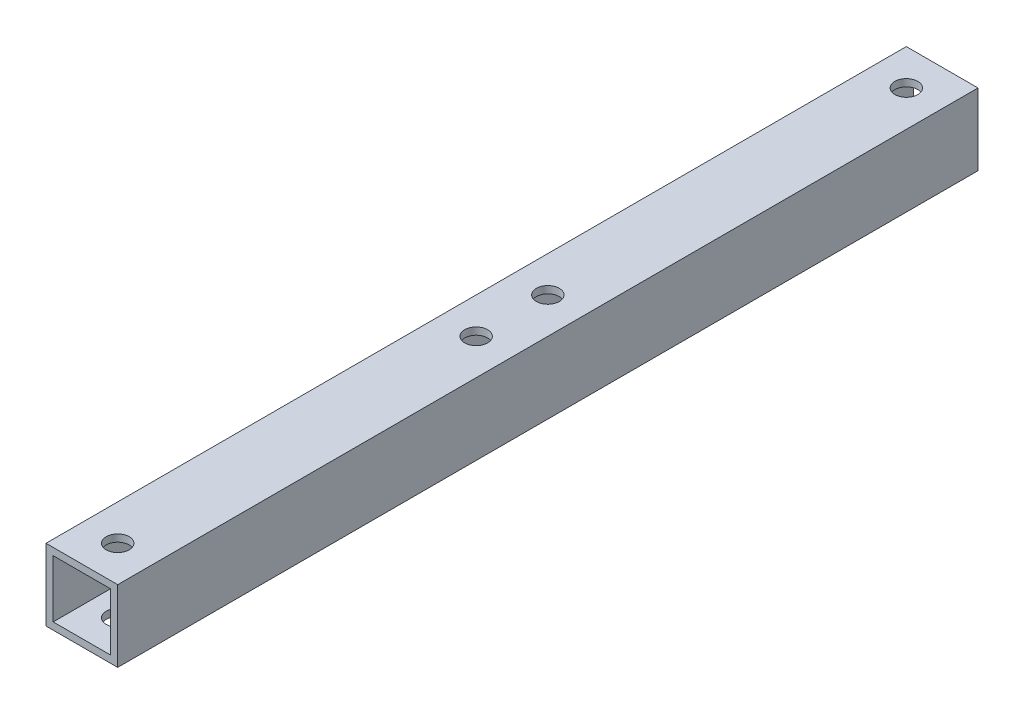
ISO-10303-21;
HEADER;
FILE_DESCRIPTION(('STEP AP214'),'2;1');
FILE_NAME('part.step','',(''),(''),'','','');
FILE_SCHEMA(('AUTOMOTIVE_DESIGN { 1 0 10303 214 1 1 1 1 }'));
ENDSEC;
DATA;
#1=APPLICATION_CONTEXT('core data for automotive mechanical design processes');
#2=APPLICATION_PROTOCOL_DEFINITION('international standard','automotive_design',2000,#1);
#3=PRODUCT_CONTEXT('',#1,'mechanical');
#4=PRODUCT('Part','Part','',(#3));
#5=PRODUCT_RELATED_PRODUCT_CATEGORY('part','',(#4));
#6=PRODUCT_DEFINITION_FORMATION('','',#4);
#7=PRODUCT_DEFINITION_CONTEXT('part definition',#1,'design');
#8=PRODUCT_DEFINITION('design','',#6,#7);
#9=PRODUCT_DEFINITION_SHAPE('','',#8);
#10=(LENGTH_UNIT() NAMED_UNIT(*) SI_UNIT(.MILLI.,.METRE.));
#11=(NAMED_UNIT(*) PLANE_ANGLE_UNIT() SI_UNIT($,.RADIAN.));
#12=(NAMED_UNIT(*) SI_UNIT($,.STERADIAN.) SOLID_ANGLE_UNIT());
#13=UNCERTAINTY_MEASURE_WITH_UNIT(LENGTH_MEASURE(1.E-05),#10,'distance_accuracy_value','');
#14=(GEOMETRIC_REPRESENTATION_CONTEXT(3) GLOBAL_UNCERTAINTY_ASSIGNED_CONTEXT((#13)) GLOBAL_UNIT_ASSIGNED_CONTEXT((#10,
#11,#12)) REPRESENTATION_CONTEXT('',''));
#15=CARTESIAN_POINT('',(0.,0.,0.));
#16=DIRECTION('',(0.,0.,1.));
#17=DIRECTION('',(1.,0.,0.));
#18=AXIS2_PLACEMENT_3D('',#15,#16,#17);
#19=CARTESIAN_POINT('',(0.,0.,120.));
#20=DIRECTION('',(0.,0.,1.));
#21=DIRECTION('',(1.,0.,0.));
#22=AXIS2_PLACEMENT_3D('',#19,#20,#21);
#23=PLANE('',#22);
#24=DIRECTION('',(0.,1.,0.));
#25=VECTOR('',#24,1.);
#26=CARTESIAN_POINT('',(5.,-5.,120.));
#27=LINE('',#26,#25);
#28=CARTESIAN_POINT('',(5.,-5.,120.));
#29=VERTEX_POINT('',#28);
#30=CARTESIAN_POINT('',(5.,5.,120.));
#31=VERTEX_POINT('',#30);
#32=EDGE_CURVE('E162',#29,#31,#27,.T.);
#33=ORIENTED_EDGE('',*,*,#32,.T.);
#34=DIRECTION('',(-1.,0.,0.));
#35=VECTOR('',#34,1.);
#36=CARTESIAN_POINT('',(-5.,5.,120.));
#37=LINE('',#36,#35);
#38=CARTESIAN_POINT('',(-5.,5.,120.));
#39=VERTEX_POINT('',#38);
#40=EDGE_CURVE('E165',#31,#39,#37,.T.);
#41=ORIENTED_EDGE('',*,*,#40,.T.);
#42=DIRECTION('',(0.,-1.,0.));
#43=VECTOR('',#42,1.);
#44=CARTESIAN_POINT('',(-5.,-5.,120.));
#45=LINE('',#44,#43);
#46=CARTESIAN_POINT('',(-5.,-5.,120.));
#47=VERTEX_POINT('',#46);
#48=EDGE_CURVE('E168',#39,#47,#45,.T.);
#49=ORIENTED_EDGE('',*,*,#48,.T.);
#50=DIRECTION('',(1.,0.,0.));
#51=VECTOR('',#50,1.);
#52=CARTESIAN_POINT('',(-5.,-5.,120.));
#53=LINE('',#52,#51);
#54=EDGE_CURVE('E170',#47,#29,#53,.T.);
#55=ORIENTED_EDGE('',*,*,#54,.T.);
#56=EDGE_LOOP('',(#33,#41,#49,#55));
#57=FACE_BOUND('',#56,.T.);
#58=DIRECTION('',(-1.,0.,0.));
#59=VECTOR('',#58,1.);
#60=CARTESIAN_POINT('',(0.,4.,120.));
#61=LINE('',#60,#59);
#62=CARTESIAN_POINT('',(4.,4.,120.));
#63=VERTEX_POINT('',#62);
#64=CARTESIAN_POINT('',(-4.,4.,120.));
#65=VERTEX_POINT('',#64);
#66=EDGE_CURVE('E132',#63,#65,#61,.T.);
#67=ORIENTED_EDGE('',*,*,#66,.F.);
#68=DIRECTION('',(0.,1.,0.));
#69=VECTOR('',#68,1.);
#70=CARTESIAN_POINT('',(4.,0.,120.));
#71=LINE('',#70,#69);
#72=CARTESIAN_POINT('',(4.,-4.,120.));
#73=VERTEX_POINT('',#72);
#74=EDGE_CURVE('E124',#73,#63,#71,.T.);
#75=ORIENTED_EDGE('',*,*,#74,.F.);
#76=DIRECTION('',(1.,0.,0.));
#77=VECTOR('',#76,1.);
#78=CARTESIAN_POINT('',(0.,-4.,120.));
#79=LINE('',#78,#77);
#80=CARTESIAN_POINT('',(-4.,-4.,120.));
#81=VERTEX_POINT('',#80);
#82=EDGE_CURVE('E146',#81,#73,#79,.T.);
#83=ORIENTED_EDGE('',*,*,#82,.F.);
#84=DIRECTION('',(0.,-1.,0.));
#85=VECTOR('',#84,1.);
#86=CARTESIAN_POINT('',(-4.,0.,120.));
#87=LINE('',#86,#85);
#88=EDGE_CURVE('E144',#65,#81,#87,.T.);
#89=ORIENTED_EDGE('',*,*,#88,.F.);
#90=EDGE_LOOP('',(#67,#75,#83,#89));
#91=FACE_BOUND('',#90,.T.);
#92=ADVANCED_FACE('F57',(#57,#91),#23,.T.);
#93=CARTESIAN_POINT('',(0.,0.,0.));
#94=DIRECTION('',(0.,0.,1.));
#95=DIRECTION('',(1.,0.,0.));
#96=AXIS2_PLACEMENT_3D('',#93,#94,#95);
#97=PLANE('',#96);
#98=DIRECTION('',(0.,1.,0.));
#99=VECTOR('',#98,1.);
#100=CARTESIAN_POINT('',(5.,-5.,0.));
#101=LINE('',#100,#99);
#102=CARTESIAN_POINT('',(5.,-5.,0.));
#103=VERTEX_POINT('',#102);
#104=CARTESIAN_POINT('',(5.,5.,0.));
#105=VERTEX_POINT('',#104);
#106=EDGE_CURVE('E140',#103,#105,#101,.T.);
#107=ORIENTED_EDGE('',*,*,#106,.F.);
#108=DIRECTION('',(1.,0.,0.));
#109=VECTOR('',#108,1.);
#110=CARTESIAN_POINT('',(-5.,-5.,0.));
#111=LINE('',#110,#109);
#112=CARTESIAN_POINT('',(-5.,-5.,0.));
#113=VERTEX_POINT('',#112);
#114=EDGE_CURVE('E166',#113,#103,#111,.T.);
#115=ORIENTED_EDGE('',*,*,#114,.F.);
#116=DIRECTION('',(0.,-1.,0.));
#117=VECTOR('',#116,1.);
#118=CARTESIAN_POINT('',(-5.,-5.,0.));
#119=LINE('',#118,#117);
#120=CARTESIAN_POINT('',(-5.,5.,0.));
#121=VERTEX_POINT('',#120);
#122=EDGE_CURVE('E177',#121,#113,#119,.T.);
#123=ORIENTED_EDGE('',*,*,#122,.F.);
#124=DIRECTION('',(-1.,0.,0.));
#125=VECTOR('',#124,1.);
#126=CARTESIAN_POINT('',(-5.,5.,0.));
#127=LINE('',#126,#125);
#128=EDGE_CURVE('E175',#105,#121,#127,.T.);
#129=ORIENTED_EDGE('',*,*,#128,.F.);
#130=EDGE_LOOP('',(#107,#115,#123,#129));
#131=FACE_BOUND('',#130,.T.);
#132=DIRECTION('',(0.,1.,0.));
#133=VECTOR('',#132,1.);
#134=CARTESIAN_POINT('',(4.,0.,0.));
#135=LINE('',#134,#133);
#136=CARTESIAN_POINT('',(4.,-4.,0.));
#137=VERTEX_POINT('',#136);
#138=CARTESIAN_POINT('',(4.,4.,0.));
#139=VERTEX_POINT('',#138);
#140=EDGE_CURVE('E82',#137,#139,#135,.T.);
#141=ORIENTED_EDGE('',*,*,#140,.T.);
#142=DIRECTION('',(-1.,0.,0.));
#143=VECTOR('',#142,1.);
#144=CARTESIAN_POINT('',(0.,4.,0.));
#145=LINE('',#144,#143);
#146=CARTESIAN_POINT('',(-4.,4.,0.));
#147=VERTEX_POINT('',#146);
#148=EDGE_CURVE('E139',#139,#147,#145,.T.);
#149=ORIENTED_EDGE('',*,*,#148,.T.);
#150=DIRECTION('',(0.,-1.,0.));
#151=VECTOR('',#150,1.);
#152=CARTESIAN_POINT('',(-4.,0.,0.));
#153=LINE('',#152,#151);
#154=CARTESIAN_POINT('',(-4.,-4.,0.));
#155=VERTEX_POINT('',#154);
#156=EDGE_CURVE('E154',#147,#155,#153,.T.);
#157=ORIENTED_EDGE('',*,*,#156,.T.);
#158=DIRECTION('',(1.,0.,0.));
#159=VECTOR('',#158,1.);
#160=CARTESIAN_POINT('',(0.,-4.,0.));
#161=LINE('',#160,#159);
#162=EDGE_CURVE('E133',#155,#137,#161,.T.);
#163=ORIENTED_EDGE('',*,*,#162,.T.);
#164=EDGE_LOOP('',(#141,#149,#157,#163));
#165=FACE_BOUND('',#164,.T.);
#166=ADVANCED_FACE('F229',(#131,#165),#97,.F.);
#167=CARTESIAN_POINT('',(5.,-5.,120.));
#168=DIRECTION('',(-1.,0.,0.));
#169=DIRECTION('',(0.,0.,1.));
#170=AXIS2_PLACEMENT_3D('',#167,#168,#169);
#171=PLANE('',#170);
#172=ORIENTED_EDGE('',*,*,#106,.T.);
#173=DIRECTION('',(0.,0.,-1.));
#174=VECTOR('',#173,1.);
#175=CARTESIAN_POINT('',(5.,5.,120.));
#176=LINE('',#175,#174);
#177=EDGE_CURVE('E12',#31,#105,#176,.T.);
#178=ORIENTED_EDGE('',*,*,#177,.F.);
#179=ORIENTED_EDGE('',*,*,#32,.F.);
#180=DIRECTION('',(0.,0.,-1.));
#181=VECTOR('',#180,1.);
#182=CARTESIAN_POINT('',(5.,-5.,120.));
#183=LINE('',#182,#181);
#184=EDGE_CURVE('E172',#29,#103,#183,.T.);
#185=ORIENTED_EDGE('',*,*,#184,.T.);
#186=EDGE_LOOP('',(#172,#178,#179,#185));
#187=FACE_BOUND('',#186,.T.);
#188=ADVANCED_FACE('F59',(#187),#171,.F.);
#189=CARTESIAN_POINT('',(-5.,5.,120.));
#190=DIRECTION('',(0.,-1.,0.));
#191=DIRECTION('',(0.,0.,-1.));
#192=AXIS2_PLACEMENT_3D('',#189,#190,#191);
#193=PLANE('',#192);
#194=CARTESIAN_POINT('',(0.,5.,5.));
#195=DIRECTION('',(0.,1.,0.));
#196=DIRECTION('',(0.,0.,1.));
#197=AXIS2_PLACEMENT_3D('',#194,#195,#196);
#198=CIRCLE('',#197,1.6);
#199=CARTESIAN_POINT('',(0.,5.,6.6));
#200=VERTEX_POINT('',#199);
#201=EDGE_CURVE('E265',#200,#200,#198,.T.);
#202=ORIENTED_EDGE('',*,*,#201,.F.);
#203=EDGE_LOOP('',(#202));
#204=FACE_BOUND('',#203,.T.);
#205=CARTESIAN_POINT('',(0.,5.,65.));
#206=DIRECTION('',(0.,1.,0.));
#207=DIRECTION('',(0.,0.,-1.));
#208=AXIS2_PLACEMENT_3D('',#205,#206,#207);
#209=CIRCLE('',#208,1.59999999999999);
#210=CARTESIAN_POINT('',(0.,5.,63.4));
#211=VERTEX_POINT('',#210);
#212=EDGE_CURVE('E269',#211,#211,#209,.T.);
#213=ORIENTED_EDGE('',*,*,#212,.F.);
#214=EDGE_LOOP('',(#213));
#215=FACE_BOUND('',#214,.T.);
#216=CARTESIAN_POINT('',(0.,5.,115.));
#217=DIRECTION('',(0.,1.,0.));
#218=DIRECTION('',(0.,0.,-1.));
#219=AXIS2_PLACEMENT_3D('',#216,#217,#218);
#220=CIRCLE('',#219,1.6);
#221=CARTESIAN_POINT('',(0.,5.,113.4));
#222=VERTEX_POINT('',#221);
#223=EDGE_CURVE('E273',#222,#222,#220,.T.);
#224=ORIENTED_EDGE('',*,*,#223,.F.);
#225=EDGE_LOOP('',(#224));
#226=FACE_BOUND('',#225,.T.);
#227=CARTESIAN_POINT('',(0.,5.,55.));
#228=DIRECTION('',(0.,1.,0.));
#229=DIRECTION('',(0.,0.,1.));
#230=AXIS2_PLACEMENT_3D('',#227,#228,#229);
#231=CIRCLE('',#230,1.6);
#232=CARTESIAN_POINT('',(0.,5.,56.6));
#233=VERTEX_POINT('',#232);
#234=EDGE_CURVE('E277',#233,#233,#231,.T.);
#235=ORIENTED_EDGE('',*,*,#234,.F.);
#236=EDGE_LOOP('',(#235));
#237=FACE_BOUND('',#236,.T.);
#238=ORIENTED_EDGE('',*,*,#128,.T.);
#239=DIRECTION('',(0.,0.,-1.));
#240=VECTOR('',#239,1.);
#241=CARTESIAN_POINT('',(-5.,5.,120.));
#242=LINE('',#241,#240);
#243=EDGE_CURVE('E66',#39,#121,#242,.T.);
#244=ORIENTED_EDGE('',*,*,#243,.F.);
#245=ORIENTED_EDGE('',*,*,#40,.F.);
#246=ORIENTED_EDGE('',*,*,#177,.T.);
#247=EDGE_LOOP('',(#238,#244,#245,#246));
#248=FACE_BOUND('',#247,.T.);
#249=ADVANCED_FACE('F254',(#204,#215,#226,#237,#248),#193,.F.);
#250=CARTESIAN_POINT('',(-5.,-5.,120.));
#251=DIRECTION('',(1.,0.,0.));
#252=DIRECTION('',(0.,0.,-1.));
#253=AXIS2_PLACEMENT_3D('',#250,#251,#252);
#254=PLANE('',#253);
#255=ORIENTED_EDGE('',*,*,#122,.T.);
#256=DIRECTION('',(0.,0.,-1.));
#257=VECTOR('',#256,1.);
#258=CARTESIAN_POINT('',(-5.,-5.,120.));
#259=LINE('',#258,#257);
#260=EDGE_CURVE('E182',#47,#113,#259,.T.);
#261=ORIENTED_EDGE('',*,*,#260,.F.);
#262=ORIENTED_EDGE('',*,*,#48,.F.);
#263=ORIENTED_EDGE('',*,*,#243,.T.);
#264=EDGE_LOOP('',(#255,#261,#262,#263));
#265=FACE_BOUND('',#264,.T.);
#266=ADVANCED_FACE('F251',(#265),#254,.F.);
#267=CARTESIAN_POINT('',(-5.,-5.,120.));
#268=DIRECTION('',(0.,1.,0.));
#269=DIRECTION('',(0.,0.,1.));
#270=AXIS2_PLACEMENT_3D('',#267,#268,#269);
#271=PLANE('',#270);
#272=CARTESIAN_POINT('',(0.,-5.,5.));
#273=DIRECTION('',(0.,1.,0.));
#274=DIRECTION('',(0.,0.,1.));
#275=AXIS2_PLACEMENT_3D('',#272,#273,#274);
#276=CIRCLE('',#275,1.6);
#277=CARTESIAN_POINT('',(0.,-5.,6.6));
#278=VERTEX_POINT('',#277);
#279=EDGE_CURVE('E191',#278,#278,#276,.T.);
#280=ORIENTED_EDGE('',*,*,#279,.T.);
#281=EDGE_LOOP('',(#280));
#282=FACE_BOUND('',#281,.T.);
#283=CARTESIAN_POINT('',(0.,-5.,65.));
#284=DIRECTION('',(0.,1.,0.));
#285=DIRECTION('',(0.,0.,-1.));
#286=AXIS2_PLACEMENT_3D('',#283,#284,#285);
#287=CIRCLE('',#286,1.59999999999999);
#288=CARTESIAN_POINT('',(0.,-5.,63.4));
#289=VERTEX_POINT('',#288);
#290=EDGE_CURVE('E298',#289,#289,#287,.T.);
#291=ORIENTED_EDGE('',*,*,#290,.T.);
#292=EDGE_LOOP('',(#291));
#293=FACE_BOUND('',#292,.T.);
#294=CARTESIAN_POINT('',(0.,-5.,115.));
#295=DIRECTION('',(0.,1.,0.));
#296=DIRECTION('',(0.,0.,-1.));
#297=AXIS2_PLACEMENT_3D('',#294,#295,#296);
#298=CIRCLE('',#297,1.6);
#299=CARTESIAN_POINT('',(0.,-5.,113.4));
#300=VERTEX_POINT('',#299);
#301=EDGE_CURVE('E291',#300,#300,#298,.T.);
#302=ORIENTED_EDGE('',*,*,#301,.T.);
#303=EDGE_LOOP('',(#302));
#304=FACE_BOUND('',#303,.T.);
#305=CARTESIAN_POINT('',(0.,-5.,55.));
#306=DIRECTION('',(0.,1.,0.));
#307=DIRECTION('',(0.,0.,1.));
#308=AXIS2_PLACEMENT_3D('',#305,#306,#307);
#309=CIRCLE('',#308,1.6);
#310=CARTESIAN_POINT('',(0.,-5.,56.6));
#311=VERTEX_POINT('',#310);
#312=EDGE_CURVE('E290',#311,#311,#309,.T.);
#313=ORIENTED_EDGE('',*,*,#312,.T.);
#314=EDGE_LOOP('',(#313));
#315=FACE_BOUND('',#314,.T.);
#316=ORIENTED_EDGE('',*,*,#114,.T.);
#317=ORIENTED_EDGE('',*,*,#184,.F.);
#318=ORIENTED_EDGE('',*,*,#54,.F.);
#319=ORIENTED_EDGE('',*,*,#260,.T.);
#320=EDGE_LOOP('',(#316,#317,#318,#319));
#321=FACE_BOUND('',#320,.T.);
#322=ADVANCED_FACE('F248',(#282,#293,#304,#315,#321),#271,.F.);
#323=CARTESIAN_POINT('',(4.,0.,120.));
#324=DIRECTION('',(-1.,0.,0.));
#325=DIRECTION('',(0.,0.,1.));
#326=AXIS2_PLACEMENT_3D('',#323,#324,#325);
#327=PLANE('',#326);
#328=ORIENTED_EDGE('',*,*,#140,.F.);
#329=DIRECTION('',(0.,0.,-1.));
#330=VECTOR('',#329,1.);
#331=CARTESIAN_POINT('',(4.,-4.,120.));
#332=LINE('',#331,#330);
#333=EDGE_CURVE('E128',#73,#137,#332,.T.);
#334=ORIENTED_EDGE('',*,*,#333,.F.);
#335=ORIENTED_EDGE('',*,*,#74,.T.);
#336=DIRECTION('',(0.,0.,-1.));
#337=VECTOR('',#336,1.);
#338=CARTESIAN_POINT('',(4.,4.,120.));
#339=LINE('',#338,#337);
#340=EDGE_CURVE('E127',#63,#139,#339,.T.);
#341=ORIENTED_EDGE('',*,*,#340,.T.);
#342=EDGE_LOOP('',(#328,#334,#335,#341));
#343=FACE_BOUND('',#342,.T.);
#344=ADVANCED_FACE('F126',(#343),#327,.T.);
#345=CARTESIAN_POINT('',(0.,4.,120.));
#346=DIRECTION('',(0.,-1.,0.));
#347=DIRECTION('',(0.,0.,-1.));
#348=AXIS2_PLACEMENT_3D('',#345,#346,#347);
#349=PLANE('',#348);
#350=CARTESIAN_POINT('',(0.,4.,5.));
#351=DIRECTION('',(0.,-1.,0.));
#352=DIRECTION('',(0.,0.,-1.));
#353=AXIS2_PLACEMENT_3D('',#350,#351,#352);
#354=CIRCLE('',#353,1.6);
#355=CARTESIAN_POINT('',(0.,4.,3.4));
#356=VERTEX_POINT('',#355);
#357=EDGE_CURVE('E152',#356,#356,#354,.T.);
#358=ORIENTED_EDGE('',*,*,#357,.F.);
#359=EDGE_LOOP('',(#358));
#360=FACE_BOUND('',#359,.T.);
#361=CARTESIAN_POINT('',(0.,4.,65.));
#362=DIRECTION('',(0.,-1.,0.));
#363=DIRECTION('',(0.,0.,-1.));
#364=AXIS2_PLACEMENT_3D('',#361,#362,#363);
#365=CIRCLE('',#364,1.59999999999999);
#366=CARTESIAN_POINT('',(0.,4.,63.4));
#367=VERTEX_POINT('',#366);
#368=EDGE_CURVE('E197',#367,#367,#365,.T.);
#369=ORIENTED_EDGE('',*,*,#368,.F.);
#370=EDGE_LOOP('',(#369));
#371=FACE_BOUND('',#370,.T.);
#372=CARTESIAN_POINT('',(0.,4.,115.));
#373=DIRECTION('',(0.,-1.,0.));
#374=DIRECTION('',(0.,0.,-1.));
#375=AXIS2_PLACEMENT_3D('',#372,#373,#374);
#376=CIRCLE('',#375,1.6);
#377=CARTESIAN_POINT('',(0.,4.,113.4));
#378=VERTEX_POINT('',#377);
#379=EDGE_CURVE('E194',#378,#378,#376,.T.);
#380=ORIENTED_EDGE('',*,*,#379,.F.);
#381=EDGE_LOOP('',(#380));
#382=FACE_BOUND('',#381,.T.);
#383=CARTESIAN_POINT('',(0.,4.,55.));
#384=DIRECTION('',(0.,-1.,0.));
#385=DIRECTION('',(0.,0.,-1.));
#386=AXIS2_PLACEMENT_3D('',#383,#384,#385);
#387=CIRCLE('',#386,1.6);
#388=CARTESIAN_POINT('',(0.,4.,53.4));
#389=VERTEX_POINT('',#388);
#390=EDGE_CURVE('E190',#389,#389,#387,.T.);
#391=ORIENTED_EDGE('',*,*,#390,.F.);
#392=EDGE_LOOP('',(#391));
#393=FACE_BOUND('',#392,.T.);
#394=ORIENTED_EDGE('',*,*,#148,.F.);
#395=ORIENTED_EDGE('',*,*,#340,.F.);
#396=ORIENTED_EDGE('',*,*,#66,.T.);
#397=DIRECTION('',(0.,0.,-1.));
#398=VECTOR('',#397,1.);
#399=CARTESIAN_POINT('',(-4.,4.,120.));
#400=LINE('',#399,#398);
#401=EDGE_CURVE('E141',#65,#147,#400,.T.);
#402=ORIENTED_EDGE('',*,*,#401,.T.);
#403=EDGE_LOOP('',(#394,#395,#396,#402));
#404=FACE_BOUND('',#403,.T.);
#405=ADVANCED_FACE('F136',(#360,#371,#382,#393,#404),#349,.T.);
#406=CARTESIAN_POINT('',(-4.,0.,120.));
#407=DIRECTION('',(1.,0.,0.));
#408=DIRECTION('',(0.,0.,-1.));
#409=AXIS2_PLACEMENT_3D('',#406,#407,#408);
#410=PLANE('',#409);
#411=ORIENTED_EDGE('',*,*,#156,.F.);
#412=ORIENTED_EDGE('',*,*,#401,.F.);
#413=ORIENTED_EDGE('',*,*,#88,.T.);
#414=DIRECTION('',(0.,0.,-1.));
#415=VECTOR('',#414,1.);
#416=CARTESIAN_POINT('',(-4.,-4.,120.));
#417=LINE('',#416,#415);
#418=EDGE_CURVE('E74',#81,#155,#417,.T.);
#419=ORIENTED_EDGE('',*,*,#418,.T.);
#420=EDGE_LOOP('',(#411,#412,#413,#419));
#421=FACE_BOUND('',#420,.T.);
#422=ADVANCED_FACE('F221',(#421),#410,.T.);
#423=CARTESIAN_POINT('',(0.,-4.,120.));
#424=DIRECTION('',(0.,1.,0.));
#425=DIRECTION('',(0.,0.,1.));
#426=AXIS2_PLACEMENT_3D('',#423,#424,#425);
#427=PLANE('',#426);
#428=CARTESIAN_POINT('',(0.,-4.,5.));
#429=DIRECTION('',(0.,1.,0.));
#430=DIRECTION('',(0.,0.,1.));
#431=AXIS2_PLACEMENT_3D('',#428,#429,#430);
#432=CIRCLE('',#431,1.6);
#433=CARTESIAN_POINT('',(0.,-4.,6.6));
#434=VERTEX_POINT('',#433);
#435=EDGE_CURVE('E61',#434,#434,#432,.T.);
#436=ORIENTED_EDGE('',*,*,#435,.F.);
#437=EDGE_LOOP('',(#436));
#438=FACE_BOUND('',#437,.T.);
#439=CARTESIAN_POINT('',(0.,-4.,65.));
#440=DIRECTION('',(0.,1.,0.));
#441=DIRECTION('',(0.,0.,1.));
#442=AXIS2_PLACEMENT_3D('',#439,#440,#441);
#443=CIRCLE('',#442,1.59999999999999);
#444=CARTESIAN_POINT('',(0.,-4.,66.6));
#445=VERTEX_POINT('',#444);
#446=EDGE_CURVE('E195',#445,#445,#443,.T.);
#447=ORIENTED_EDGE('',*,*,#446,.F.);
#448=EDGE_LOOP('',(#447));
#449=FACE_BOUND('',#448,.T.);
#450=CARTESIAN_POINT('',(0.,-4.,115.));
#451=DIRECTION('',(0.,1.,0.));
#452=DIRECTION('',(0.,0.,1.));
#453=AXIS2_PLACEMENT_3D('',#450,#451,#452);
#454=CIRCLE('',#453,1.6);
#455=CARTESIAN_POINT('',(0.,-4.,116.6));
#456=VERTEX_POINT('',#455);
#457=EDGE_CURVE('E192',#456,#456,#454,.T.);
#458=ORIENTED_EDGE('',*,*,#457,.F.);
#459=EDGE_LOOP('',(#458));
#460=FACE_BOUND('',#459,.T.);
#461=CARTESIAN_POINT('',(0.,-4.,55.));
#462=DIRECTION('',(0.,1.,0.));
#463=DIRECTION('',(0.,0.,1.));
#464=AXIS2_PLACEMENT_3D('',#461,#462,#463);
#465=CIRCLE('',#464,1.6);
#466=CARTESIAN_POINT('',(0.,-4.,56.6));
#467=VERTEX_POINT('',#466);
#468=EDGE_CURVE('E187',#467,#467,#465,.T.);
#469=ORIENTED_EDGE('',*,*,#468,.F.);
#470=EDGE_LOOP('',(#469));
#471=FACE_BOUND('',#470,.T.);
#472=ORIENTED_EDGE('',*,*,#162,.F.);
#473=ORIENTED_EDGE('',*,*,#418,.F.);
#474=ORIENTED_EDGE('',*,*,#82,.T.);
#475=ORIENTED_EDGE('',*,*,#333,.T.);
#476=EDGE_LOOP('',(#472,#473,#474,#475));
#477=FACE_BOUND('',#476,.T.);
#478=ADVANCED_FACE('F217',(#438,#449,#460,#471,#477),#427,.T.);
#479=CARTESIAN_POINT('',(0.,-5.,55.));
#480=DIRECTION('',(0.,1.,0.));
#481=DIRECTION('',(0.,0.,1.));
#482=AXIS2_PLACEMENT_3D('',#479,#480,#481);
#483=CYLINDRICAL_SURFACE('',#482,1.6);
#484=ORIENTED_EDGE('',*,*,#468,.T.);
#485=EDGE_LOOP('',(#484));
#486=FACE_BOUND('',#485,.T.);
#487=ORIENTED_EDGE('',*,*,#312,.F.);
#488=EDGE_LOOP('',(#487));
#489=FACE_BOUND('',#488,.T.);
#490=ADVANCED_FACE('F220',(#486,#489),#483,.F.);
#491=CARTESIAN_POINT('',(0.,-5.,115.));
#492=DIRECTION('',(0.,1.,0.));
#493=DIRECTION('',(0.,0.,1.));
#494=AXIS2_PLACEMENT_3D('',#491,#492,#493);
#495=CYLINDRICAL_SURFACE('',#494,1.6);
#496=ORIENTED_EDGE('',*,*,#457,.T.);
#497=EDGE_LOOP('',(#496));
#498=FACE_BOUND('',#497,.T.);
#499=ORIENTED_EDGE('',*,*,#301,.F.);
#500=EDGE_LOOP('',(#499));
#501=FACE_BOUND('',#500,.T.);
#502=ADVANCED_FACE('F320',(#498,#501),#495,.F.);
#503=CARTESIAN_POINT('',(0.,-5.,65.));
#504=DIRECTION('',(0.,1.,0.));
#505=DIRECTION('',(0.,0.,1.));
#506=AXIS2_PLACEMENT_3D('',#503,#504,#505);
#507=CYLINDRICAL_SURFACE('',#506,1.59999999999999);
#508=ORIENTED_EDGE('',*,*,#446,.T.);
#509=EDGE_LOOP('',(#508));
#510=FACE_BOUND('',#509,.T.);
#511=ORIENTED_EDGE('',*,*,#290,.F.);
#512=EDGE_LOOP('',(#511));
#513=FACE_BOUND('',#512,.T.);
#514=ADVANCED_FACE('F310',(#510,#513),#507,.F.);
#515=CARTESIAN_POINT('',(0.,-5.,5.));
#516=DIRECTION('',(0.,1.,0.));
#517=DIRECTION('',(0.,0.,1.));
#518=AXIS2_PLACEMENT_3D('',#515,#516,#517);
#519=CYLINDRICAL_SURFACE('',#518,1.6);
#520=ORIENTED_EDGE('',*,*,#435,.T.);
#521=EDGE_LOOP('',(#520));
#522=FACE_BOUND('',#521,.T.);
#523=ORIENTED_EDGE('',*,*,#279,.F.);
#524=EDGE_LOOP('',(#523));
#525=FACE_BOUND('',#524,.T.);
#526=ADVANCED_FACE('F214',(#522,#525),#519,.F.);
#527=ORIENTED_EDGE('',*,*,#390,.T.);
#528=EDGE_LOOP('',(#527));
#529=FACE_BOUND('',#528,.T.);
#530=ORIENTED_EDGE('',*,*,#234,.T.);
#531=EDGE_LOOP('',(#530));
#532=FACE_BOUND('',#531,.T.);
#533=ADVANCED_FACE('F309',(#529,#532),#483,.F.);
#534=ORIENTED_EDGE('',*,*,#379,.T.);
#535=EDGE_LOOP('',(#534));
#536=FACE_BOUND('',#535,.T.);
#537=ORIENTED_EDGE('',*,*,#223,.T.);
#538=EDGE_LOOP('',(#537));
#539=FACE_BOUND('',#538,.T.);
#540=ADVANCED_FACE('F317',(#536,#539),#495,.F.);
#541=ORIENTED_EDGE('',*,*,#368,.T.);
#542=EDGE_LOOP('',(#541));
#543=FACE_BOUND('',#542,.T.);
#544=ORIENTED_EDGE('',*,*,#212,.T.);
#545=EDGE_LOOP('',(#544));
#546=FACE_BOUND('',#545,.T.);
#547=ADVANCED_FACE('F322',(#543,#546),#507,.F.);
#548=ORIENTED_EDGE('',*,*,#357,.T.);
#549=EDGE_LOOP('',(#548));
#550=FACE_BOUND('',#549,.T.);
#551=ORIENTED_EDGE('',*,*,#201,.T.);
#552=EDGE_LOOP('',(#551));
#553=FACE_BOUND('',#552,.T.);
#554=ADVANCED_FACE('F312',(#550,#553),#519,.F.);
#555=CLOSED_SHELL('',(#92,#166,#188,#249,#266,#322,#344,#405,#422,#478,#490,#502,#514,#526,#533,
#540,#547,#554));
#556=MANIFOLD_SOLID_BREP('B2',#555);
#557=ADVANCED_BREP_SHAPE_REPRESENTATION('',(#18,#556),#14);
#558=SHAPE_DEFINITION_REPRESENTATION(#9,#557);
ENDSEC;
END-ISO-10303-21;
